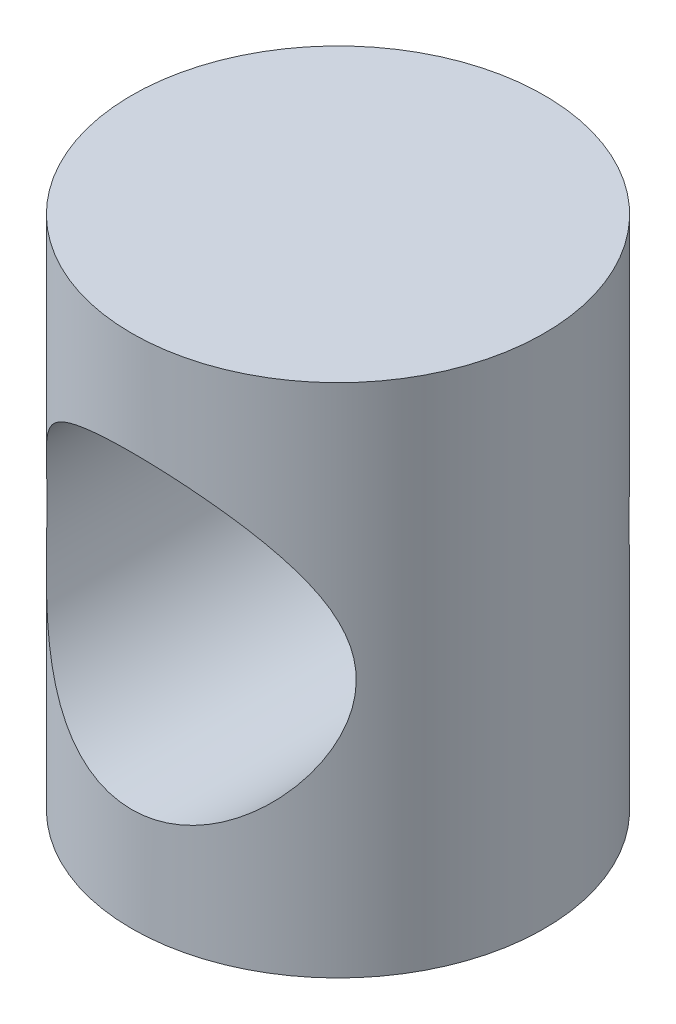
ISO-10303-21;
HEADER;
FILE_DESCRIPTION(('STEP AP214'),'2;1');
FILE_NAME('part.step','',(''),(''),'','','');
FILE_SCHEMA(('AUTOMOTIVE_DESIGN { 1 0 10303 214 1 1 1 1 }'));
ENDSEC;
DATA;
#1=APPLICATION_CONTEXT('core data for automotive mechanical design processes');
#2=APPLICATION_PROTOCOL_DEFINITION('international standard','automotive_design',2000,#1);
#3=PRODUCT_CONTEXT('',#1,'mechanical');
#4=PRODUCT('Part','Part','',(#3));
#5=PRODUCT_RELATED_PRODUCT_CATEGORY('part','',(#4));
#6=PRODUCT_DEFINITION_FORMATION('','',#4);
#7=PRODUCT_DEFINITION_CONTEXT('part definition',#1,'design');
#8=PRODUCT_DEFINITION('design','',#6,#7);
#9=PRODUCT_DEFINITION_SHAPE('','',#8);
#10=(LENGTH_UNIT() NAMED_UNIT(*) SI_UNIT(.MILLI.,.METRE.));
#11=(NAMED_UNIT(*) PLANE_ANGLE_UNIT() SI_UNIT($,.RADIAN.));
#12=(NAMED_UNIT(*) SI_UNIT($,.STERADIAN.) SOLID_ANGLE_UNIT());
#13=UNCERTAINTY_MEASURE_WITH_UNIT(LENGTH_MEASURE(1.E-05),#10,'distance_accuracy_value','');
#14=(GEOMETRIC_REPRESENTATION_CONTEXT(3) GLOBAL_UNCERTAINTY_ASSIGNED_CONTEXT((#13)) GLOBAL_UNIT_ASSIGNED_CONTEXT((#10,
#11,#12)) REPRESENTATION_CONTEXT('',''));
#15=CARTESIAN_POINT('',(0.,0.,0.));
#16=DIRECTION('',(0.,0.,1.));
#17=DIRECTION('',(1.,0.,0.));
#18=AXIS2_PLACEMENT_3D('',#15,#16,#17);
#19=CARTESIAN_POINT('',(0.,5.,0.));
#20=DIRECTION('',(0.,1.,0.));
#21=DIRECTION('',(0.,0.,1.));
#22=AXIS2_PLACEMENT_3D('',#19,#20,#21);
#23=PLANE('',#22);
#24=CARTESIAN_POINT('',(0.,5.,0.));
#25=DIRECTION('',(0.,1.,0.));
#26=DIRECTION('',(0.,0.,1.));
#27=AXIS2_PLACEMENT_3D('',#24,#25,#26);
#28=CIRCLE('',#27,2.);
#29=CARTESIAN_POINT('',(0.,5.,2.));
#30=VERTEX_POINT('',#29);
#31=EDGE_CURVE('E92',#30,#30,#28,.T.);
#32=ORIENTED_EDGE('',*,*,#31,.T.);
#33=EDGE_LOOP('',(#32));
#34=FACE_BOUND('',#33,.T.);
#35=ADVANCED_FACE('F72',(#34),#23,.T.);
#36=CARTESIAN_POINT('',(0.,0.,0.));
#37=DIRECTION('',(0.,1.,0.));
#38=DIRECTION('',(0.,0.,1.));
#39=AXIS2_PLACEMENT_3D('',#36,#37,#38);
#40=PLANE('',#39);
#41=CARTESIAN_POINT('',(0.,0.,0.));
#42=DIRECTION('',(0.,1.,0.));
#43=DIRECTION('',(0.,0.,1.));
#44=AXIS2_PLACEMENT_3D('',#41,#42,#43);
#45=CIRCLE('',#44,2.);
#46=CARTESIAN_POINT('',(0.,0.,2.));
#47=VERTEX_POINT('',#46);
#48=EDGE_CURVE('E88',#47,#47,#45,.T.);
#49=ORIENTED_EDGE('',*,*,#48,.F.);
#50=EDGE_LOOP('',(#49));
#51=FACE_BOUND('',#50,.T.);
#52=ADVANCED_FACE('F74',(#51),#40,.F.);
#53=CARTESIAN_POINT('',(0.,2.5,-2.));
#54=DIRECTION('',(0.,0.,1.));
#55=DIRECTION('',(1.,0.,0.));
#56=AXIS2_PLACEMENT_3D('',#53,#54,#55);
#57=CYLINDRICAL_SURFACE('',#56,1.5);
#58=CARTESIAN_POINT('',(0.,4.,-2.));
#59=CARTESIAN_POINT('',(-0.0733238168883633,3.99999566298493,-1.99999582732985));
#60=CARTESIAN_POINT('',(-0.14668514696909,3.99458679289183,-1.99593030514466));
#61=CARTESIAN_POINT('',(-0.291031393710365,3.9733088012809,-1.98004809806574));
#62=CARTESIAN_POINT('',(-0.362013853880637,3.95742919711072,-1.96822364546775));
#63=CARTESIAN_POINT('',(-0.499226006736961,3.91629069380892,-1.93795940216806));
#64=CARTESIAN_POINT('',(-0.565479447961751,3.89108327384293,-1.91955593885509));
#65=CARTESIAN_POINT('',(-0.692400320708705,3.83246927536516,-1.8775137850865));
#66=CARTESIAN_POINT('',(-0.753067446036845,3.7990622477885,-1.85387480790637));
#67=CARTESIAN_POINT('',(-0.873468550310338,3.72173549036761,-1.80049441205848));
#68=CARTESIAN_POINT('',(-0.932597680301103,3.6771293706302,-1.77039085687857));
#69=CARTESIAN_POINT('',(-1.04303088076967,3.58050031792622,-1.70766776976302));
#70=CARTESIAN_POINT('',(-1.09432320399861,3.52846647241548,-1.67504456900533));
#71=CARTESIAN_POINT('',(-1.19837128676082,3.40641746194881,-1.60271148251862));
#72=CARTESIAN_POINT('',(-1.24930515925708,3.33489720925114,-1.56290904326244));
#73=CARTESIAN_POINT('',(-1.33861950030476,3.18254998804343,-1.48711489074728));
#74=CARTESIAN_POINT('',(-1.37701697513755,3.10173583027239,-1.45111806021123));
#75=CARTESIAN_POINT('',(-1.42880629654057,2.96049711350408,-1.39977153462232));
#76=CARTESIAN_POINT('',(-1.44625677448576,2.90260920437311,-1.38157748099639));
#77=CARTESIAN_POINT('',(-1.4742067432798,2.78360716138381,-1.35171592156367));
#78=CARTESIAN_POINT('',(-1.48472215909638,2.72250076932552,-1.34003347280188));
#79=CARTESIAN_POINT('',(-1.49812821587031,2.59781746728411,-1.3250376031534));
#80=CARTESIAN_POINT('',(-1.50094954405843,2.53422330069143,-1.32180027198211));
#81=CARTESIAN_POINT('',(-1.49848214107473,2.40738519595469,-1.32459530781419));
#82=CARTESIAN_POINT('',(-1.49319048866828,2.34414139219557,-1.33063101375447));
#83=CARTESIAN_POINT('',(-1.47597738127146,2.22680856967773,-1.34967624602736));
#84=CARTESIAN_POINT('',(-1.46482483213393,2.17246346629251,-1.36187160711147));
#85=CARTESIAN_POINT('',(-1.43705665967472,2.06656096666638,-1.39114197964015));
#86=CARTESIAN_POINT('',(-1.42043580174443,2.01500629688714,-1.40822166460929));
#87=CARTESIAN_POINT('',(-1.37033053483048,1.8837433063796,-1.45741780802484));
#88=CARTESIAN_POINT('',(-1.33280125154412,1.8065990023113,-1.49225675406362));
#89=CARTESIAN_POINT('',(-1.24617980845438,1.66080295010744,-1.5653332737001));
#90=CARTESIAN_POINT('',(-1.19705963959762,1.5921723979568,-1.60357893794201));
#91=CARTESIAN_POINT('',(-1.08652041546593,1.4622515349125,-1.68051381321895));
#92=CARTESIAN_POINT('',(-1.02482371790806,1.40118857745593,-1.71919007917324));
#93=CARTESIAN_POINT('',(-0.890432683412945,1.2897438618303,-1.79247519341789));
#94=CARTESIAN_POINT('',(-0.817758175443478,1.2393432307867,-1.82709117937862));
#95=CARTESIAN_POINT('',(-0.677874986679999,1.16000272958802,-1.88280890008291));
#96=CARTESIAN_POINT('',(-0.612485632402769,1.12878643178463,-1.90522876624556));
#97=CARTESIAN_POINT('',(-0.476277786535075,1.07575398481977,-1.94374438176642));
#98=CARTESIAN_POINT('',(-0.405467967926301,1.05392317408628,-1.95984999147025));
#99=CARTESIAN_POINT('',(-0.278754069890312,1.02508402209845,-1.98123986707286));
#100=CARTESIAN_POINT('',(-0.223667369488179,1.01571309060527,-1.98823801093148));
#101=CARTESIAN_POINT('',(-0.112394497180507,1.00316926297947,-1.99761979157085));
#102=CARTESIAN_POINT('',(-0.0562082706902792,0.999996675348782,-2.00000319866836));
#103=CARTESIAN_POINT('',(0.073323816888364,1.00000433701507,-1.99999582732985));
#104=CARTESIAN_POINT('',(0.146685146969091,1.00541320710817,-1.99593030514466));
#105=CARTESIAN_POINT('',(0.291031393710366,1.0266911987191,-1.98004809806574));
#106=CARTESIAN_POINT('',(0.362013853880638,1.04257080288928,-1.96822364546775));
#107=CARTESIAN_POINT('',(0.499226006736962,1.08370930619108,-1.93795940216806));
#108=CARTESIAN_POINT('',(0.565479447961751,1.10891672615707,-1.91955593885509));
#109=CARTESIAN_POINT('',(0.692400320708705,1.16753072463484,-1.8775137850865));
#110=CARTESIAN_POINT('',(0.753067446036845,1.2009377522115,-1.85387480790637));
#111=CARTESIAN_POINT('',(0.873468550310339,1.27826450963239,-1.80049441205848));
#112=CARTESIAN_POINT('',(0.932597680301103,1.3228706293698,-1.77039085687857));
#113=CARTESIAN_POINT('',(1.04303088076967,1.41949968207378,-1.70766776976301));
#114=CARTESIAN_POINT('',(1.09432320399861,1.47153352758452,-1.67504456900533));
#115=CARTESIAN_POINT('',(1.19837128676082,1.59358253805119,-1.60271148251862));
#116=CARTESIAN_POINT('',(1.24930515925708,1.66510279074887,-1.56290904326244));
#117=CARTESIAN_POINT('',(1.33861950030476,1.81745001195657,-1.48711489074728));
#118=CARTESIAN_POINT('',(1.37701697513755,1.89826416972761,-1.45111806021123));
#119=CARTESIAN_POINT('',(1.42880629654057,2.03950288649592,-1.39977153462232));
#120=CARTESIAN_POINT('',(1.44625677448576,2.09739079562689,-1.38157748099639));
#121=CARTESIAN_POINT('',(1.4742067432798,2.21639283861619,-1.35171592156367));
#122=CARTESIAN_POINT('',(1.48472215909638,2.27749923067449,-1.34003347280188));
#123=CARTESIAN_POINT('',(1.49812821587031,2.4021825327159,-1.3250376031534));
#124=CARTESIAN_POINT('',(1.50094954405843,2.46577669930857,-1.32180027198211));
#125=CARTESIAN_POINT('',(1.49848214107473,2.59261480404531,-1.32459530781419));
#126=CARTESIAN_POINT('',(1.49319048866828,2.65585860780443,-1.33063101375447));
#127=CARTESIAN_POINT('',(1.47597738127146,2.77319143032227,-1.34967624602737));
#128=CARTESIAN_POINT('',(1.46482483213393,2.8275365337075,-1.36187160711147));
#129=CARTESIAN_POINT('',(1.43705665967472,2.93343903333362,-1.39114197964015));
#130=CARTESIAN_POINT('',(1.42043580174443,2.98499370311287,-1.40822166460929));
#131=CARTESIAN_POINT('',(1.37033053483048,3.1162566936204,-1.45741780802484));
#132=CARTESIAN_POINT('',(1.33280125154412,3.1934009976887,-1.49225675406362));
#133=CARTESIAN_POINT('',(1.24617980845438,3.33919704989256,-1.5653332737001));
#134=CARTESIAN_POINT('',(1.19705963959762,3.4078276020432,-1.60357893794201));
#135=CARTESIAN_POINT('',(1.08652041546593,3.5377484650875,-1.68051381321895));
#136=CARTESIAN_POINT('',(1.02482371790806,3.59881142254407,-1.71919007917324));
#137=CARTESIAN_POINT('',(0.890432683412945,3.7102561381697,-1.79247519341789));
#138=CARTESIAN_POINT('',(0.817758175443478,3.7606567692133,-1.82709117937862));
#139=CARTESIAN_POINT('',(0.677874986679999,3.83999727041198,-1.88280890008291));
#140=CARTESIAN_POINT('',(0.612485632402769,3.87121356821538,-1.90522876624556));
#141=CARTESIAN_POINT('',(0.476277786535074,3.92424601518023,-1.94374438176642));
#142=CARTESIAN_POINT('',(0.4054679679263,3.94607682591372,-1.95984999147025));
#143=CARTESIAN_POINT('',(0.278754069890311,3.97491597790155,-1.98123986707286));
#144=CARTESIAN_POINT('',(0.223667369488178,3.98428690939473,-1.98823801093148));
#145=CARTESIAN_POINT('',(0.112394497180506,3.99683073702053,-1.99761979157085));
#146=CARTESIAN_POINT('',(0.0562082706902792,4.00000332465122,-2.00000319866836));
#147=CARTESIAN_POINT('',(0.,4.,-2.));
#148=B_SPLINE_CURVE_WITH_KNOTS('',3,(#58,#59,#60,#61,#62,#63,#64,#65,#66,#67,#68,#69,#70,#71,
#72,#73,#74,#75,#76,#77,#78,#79,#80,#81,#82,#83,#84,#85,#86,#87,#88,#89,#90,#91,#92,#93,#94,#95,
#96,#97,#98,#99,#100,#101,#102,#103,#104,#105,#106,#107,#108,#109,#110,#111,#112,#113,#114,#115,
#116,#117,#118,#119,#120,#121,#122,#123,#124,#125,#126,#127,#128,#129,#130,#131,#132,#133,#134,
#135,#136,#137,#138,#139,#140,#141,#142,#143,#144,#145,#146,#147),.UNSPECIFIED.,.T.,.F.,(4,2,2,
2,2,2,2,2,2,2,2,2,2,2,2,2,2,2,2,2,2,2,2,2,2,2,2,2,2,2,2,2,2,2,2,2,2,2,2,2,2,2,2,2,4),(0.,
0.219737979931881,0.439696282648436,0.658458337658062,0.877232376202583,1.11623310988778,
1.35558865936366,1.64359835682849,1.93121571479709,2.11999531937708,2.30833990629147,
2.49837569077001,2.68847991735786,2.85826912974225,3.02822135024108,3.30449433924013,
3.58144189728547,3.86533764056814,4.14872658940876,4.37537162341049,4.60166130508969,
4.77009876092341,4.93854459995755,5.15828257988943,5.37824088260599,5.59700293761561,
5.81577697616013,6.05477770984534,6.29413325932121,6.58214295678604,6.86976031475464,
7.05853991933464,7.24688450624902,7.43692029072756,7.62702451731541,7.79681372969981,
7.96676595019863,8.24303893919769,8.51998649724302,8.80388224052569,9.08727118936631,
9.31391622336805,9.54020590504724,9.70864336088096,9.8770891999151),.UNSPECIFIED.);
#149=CARTESIAN_POINT('',(0.,4.,-2.));
#150=VERTEX_POINT('',#149);
#151=EDGE_CURVE('E84',#150,#150,#148,.T.);
#152=ORIENTED_EDGE('',*,*,#151,.F.);
#153=EDGE_LOOP('',(#152));
#154=FACE_BOUND('',#153,.T.);
#155=CARTESIAN_POINT('',(0.,4.,2.));
#156=CARTESIAN_POINT('',(0.0733238168883637,3.99999566298493,1.99999582732985));
#157=CARTESIAN_POINT('',(0.146685146969091,3.99458679289183,1.99593030514466));
#158=CARTESIAN_POINT('',(0.291031393710366,3.9733088012809,1.98004809806574));
#159=CARTESIAN_POINT('',(0.362013853880638,3.95742919711072,1.96822364546775));
#160=CARTESIAN_POINT('',(0.499226006736962,3.91629069380892,1.93795940216806));
#161=CARTESIAN_POINT('',(0.565479447961752,3.89108327384293,1.91955593885509));
#162=CARTESIAN_POINT('',(0.692400320708705,3.83246927536516,1.8775137850865));
#163=CARTESIAN_POINT('',(0.753067446036846,3.7990622477885,1.85387480790636));
#164=CARTESIAN_POINT('',(0.873468550310339,3.72173549036761,1.80049441205848));
#165=CARTESIAN_POINT('',(0.932597680301104,3.6771293706302,1.77039085687857));
#166=CARTESIAN_POINT('',(1.04303088076967,3.58050031792622,1.70766776976302));
#167=CARTESIAN_POINT('',(1.09432320399861,3.52846647241548,1.67504456900533));
#168=CARTESIAN_POINT('',(1.19837128676082,3.40641746194881,1.60271148251862));
#169=CARTESIAN_POINT('',(1.24930515925708,3.33489720925113,1.56290904326244));
#170=CARTESIAN_POINT('',(1.33861950030476,3.18254998804343,1.48711489074727));
#171=CARTESIAN_POINT('',(1.37701697513755,3.10173583027239,1.45111806021123));
#172=CARTESIAN_POINT('',(1.42880629654057,2.96049711350408,1.39977153462232));
#173=CARTESIAN_POINT('',(1.44625677448576,2.90260920437311,1.38157748099639));
#174=CARTESIAN_POINT('',(1.4742067432798,2.78360716138381,1.35171592156367));
#175=CARTESIAN_POINT('',(1.48472215909638,2.72250076932551,1.34003347280188));
#176=CARTESIAN_POINT('',(1.49812821587031,2.5978174672841,1.3250376031534));
#177=CARTESIAN_POINT('',(1.50094954405843,2.53422330069143,1.32180027198211));
#178=CARTESIAN_POINT('',(1.49848214107473,2.40738519595469,1.32459530781419));
#179=CARTESIAN_POINT('',(1.49319048866828,2.34414139219557,1.33063101375447));
#180=CARTESIAN_POINT('',(1.47597738127146,2.22680856967773,1.34967624602737));
#181=CARTESIAN_POINT('',(1.46482483213393,2.17246346629251,1.36187160711147));
#182=CARTESIAN_POINT('',(1.43705665967472,2.06656096666638,1.39114197964014));
#183=CARTESIAN_POINT('',(1.42043580174443,2.01500629688713,1.40822166460929));
#184=CARTESIAN_POINT('',(1.37033053483048,1.8837433063796,1.45741780802484));
#185=CARTESIAN_POINT('',(1.33280125154412,1.8065990023113,1.49225675406362));
#186=CARTESIAN_POINT('',(1.24617980845438,1.66080295010744,1.5653332737001));
#187=CARTESIAN_POINT('',(1.19705963959762,1.5921723979568,1.60357893794201));
#188=CARTESIAN_POINT('',(1.08652041546593,1.4622515349125,1.68051381321895));
#189=CARTESIAN_POINT('',(1.02482371790806,1.40118857745593,1.71919007917324));
#190=CARTESIAN_POINT('',(0.890432683412945,1.2897438618303,1.79247519341789));
#191=CARTESIAN_POINT('',(0.817758175443477,1.2393432307867,1.82709117937862));
#192=CARTESIAN_POINT('',(0.677874986679999,1.16000272958802,1.88280890008291));
#193=CARTESIAN_POINT('',(0.612485632402769,1.12878643178462,1.90522876624556));
#194=CARTESIAN_POINT('',(0.476277786535074,1.07575398481977,1.94374438176642));
#195=CARTESIAN_POINT('',(0.405467967926301,1.05392317408628,1.95984999147025));
#196=CARTESIAN_POINT('',(0.278754069890311,1.02508402209845,1.98123986707286));
#197=CARTESIAN_POINT('',(0.223667369488179,1.01571309060527,1.98823801093148));
#198=CARTESIAN_POINT('',(0.112394497180507,1.00316926297947,1.99761979157085));
#199=CARTESIAN_POINT('',(0.0562082706902795,0.999996675348782,2.00000319866836));
#200=CARTESIAN_POINT('',(-0.0733238168883632,1.00000433701507,1.99999582732985));
#201=CARTESIAN_POINT('',(-0.14668514696909,1.00541320710817,1.99593030514466));
#202=CARTESIAN_POINT('',(-0.291031393710365,1.0266911987191,1.98004809806574));
#203=CARTESIAN_POINT('',(-0.362013853880638,1.04257080288928,1.96822364546775));
#204=CARTESIAN_POINT('',(-0.499226006736962,1.08370930619108,1.93795940216806));
#205=CARTESIAN_POINT('',(-0.565479447961752,1.10891672615707,1.91955593885509));
#206=CARTESIAN_POINT('',(-0.692400320708705,1.16753072463484,1.8775137850865));
#207=CARTESIAN_POINT('',(-0.753067446036846,1.2009377522115,1.85387480790636));
#208=CARTESIAN_POINT('',(-0.873468550310339,1.27826450963239,1.80049441205848));
#209=CARTESIAN_POINT('',(-0.932597680301103,1.3228706293698,1.77039085687857));
#210=CARTESIAN_POINT('',(-1.04303088076967,1.41949968207378,1.70766776976302));
#211=CARTESIAN_POINT('',(-1.09432320399861,1.47153352758452,1.67504456900533));
#212=CARTESIAN_POINT('',(-1.19837128676082,1.59358253805119,1.60271148251862));
#213=CARTESIAN_POINT('',(-1.24930515925708,1.66510279074887,1.56290904326244));
#214=CARTESIAN_POINT('',(-1.33861950030476,1.81745001195657,1.48711489074728));
#215=CARTESIAN_POINT('',(-1.37701697513755,1.89826416972761,1.45111806021123));
#216=CARTESIAN_POINT('',(-1.42880629654057,2.03950288649592,1.39977153462232));
#217=CARTESIAN_POINT('',(-1.44625677448576,2.09739079562689,1.38157748099639));
#218=CARTESIAN_POINT('',(-1.4742067432798,2.21639283861619,1.35171592156367));
#219=CARTESIAN_POINT('',(-1.48472215909638,2.27749923067449,1.34003347280188));
#220=CARTESIAN_POINT('',(-1.49812821587031,2.4021825327159,1.3250376031534));
#221=CARTESIAN_POINT('',(-1.50094954405843,2.46577669930857,1.32180027198211));
#222=CARTESIAN_POINT('',(-1.49848214107473,2.59261480404531,1.32459530781419));
#223=CARTESIAN_POINT('',(-1.49319048866828,2.65585860780443,1.33063101375447));
#224=CARTESIAN_POINT('',(-1.47597738127146,2.77319143032227,1.34967624602737));
#225=CARTESIAN_POINT('',(-1.46482483213393,2.8275365337075,1.36187160711147));
#226=CARTESIAN_POINT('',(-1.43705665967472,2.93343903333362,1.39114197964015));
#227=CARTESIAN_POINT('',(-1.42043580174443,2.98499370311287,1.40822166460929));
#228=CARTESIAN_POINT('',(-1.37033053483048,3.1162566936204,1.45741780802484));
#229=CARTESIAN_POINT('',(-1.33280125154412,3.1934009976887,1.49225675406362));
#230=CARTESIAN_POINT('',(-1.24617980845438,3.33919704989256,1.5653332737001));
#231=CARTESIAN_POINT('',(-1.19705963959762,3.4078276020432,1.60357893794201));
#232=CARTESIAN_POINT('',(-1.08652041546593,3.5377484650875,1.68051381321895));
#233=CARTESIAN_POINT('',(-1.02482371790805,3.59881142254407,1.71919007917324));
#234=CARTESIAN_POINT('',(-0.890432683412943,3.7102561381697,1.79247519341789));
#235=CARTESIAN_POINT('',(-0.817758175443476,3.76065676921331,1.82709117937862));
#236=CARTESIAN_POINT('',(-0.677874986679998,3.83999727041198,1.88280890008291));
#237=CARTESIAN_POINT('',(-0.612485632402768,3.87121356821538,1.90522876624556));
#238=CARTESIAN_POINT('',(-0.476277786535074,3.92424601518023,1.94374438176642));
#239=CARTESIAN_POINT('',(-0.4054679679263,3.94607682591372,1.95984999147025));
#240=CARTESIAN_POINT('',(-0.27875406989031,3.97491597790155,1.98123986707286));
#241=CARTESIAN_POINT('',(-0.223667369488178,3.98428690939473,1.98823801093148));
#242=CARTESIAN_POINT('',(-0.112394497180506,3.99683073702053,1.99761979157085));
#243=CARTESIAN_POINT('',(-0.0562082706902792,4.00000332465122,2.00000319866836));
#244=CARTESIAN_POINT('',(0.,4.,2.));
#245=B_SPLINE_CURVE_WITH_KNOTS('',3,(#155,#156,#157,#158,#159,#160,#161,#162,#163,#164,#165,
#166,#167,#168,#169,#170,#171,#172,#173,#174,#175,#176,#177,#178,#179,#180,#181,#182,#183,#184,
#185,#186,#187,#188,#189,#190,#191,#192,#193,#194,#195,#196,#197,#198,#199,#200,#201,#202,#203,
#204,#205,#206,#207,#208,#209,#210,#211,#212,#213,#214,#215,#216,#217,#218,#219,#220,#221,#222,
#223,#224,#225,#226,#227,#228,#229,#230,#231,#232,#233,#234,#235,#236,#237,#238,#239,#240,#241,
#242,#243,#244),.UNSPECIFIED.,.T.,.F.,(4,2,2,2,2,2,2,2,2,2,2,2,2,2,2,2,2,2,2,2,2,2,2,2,2,2,2,2,
2,2,2,2,2,2,2,2,2,2,2,2,2,2,2,2,4),(0.,0.219737979931881,0.439696282648436,0.658458337658062,
0.877232376202583,1.11623310988778,1.35558865936366,1.64359835682849,1.93121571479709,
2.11999531937708,2.30833990629147,2.49837569077001,2.68847991735786,2.85826912974225,
3.02822135024108,3.30449433924014,3.58144189728547,3.86533764056814,4.14872658940876,
4.3753716234105,4.60166130508969,4.77009876092341,4.93854459995755,5.15828257988943,
5.37824088260599,5.59700293761562,5.81577697616014,6.05477770984534,6.29413325932121,
6.58214295678604,6.86976031475465,7.05853991933464,7.24688450624902,7.43692029072756,
7.62702451731541,7.79681372969981,7.96676595019864,8.24303893919769,8.51998649724302,
8.8038822405257,9.08727118936631,9.31391622336805,9.54020590504724,9.70864336088096,
9.87708919991511),.UNSPECIFIED.);
#246=CARTESIAN_POINT('',(0.,4.,2.));
#247=VERTEX_POINT('',#246);
#248=EDGE_CURVE('E11',#247,#247,#245,.T.);
#249=ORIENTED_EDGE('',*,*,#248,.F.);
#250=EDGE_LOOP('',(#249));
#251=FACE_BOUND('',#250,.T.);
#252=ADVANCED_FACE('F98',(#154,#251),#57,.F.);
#253=CARTESIAN_POINT('',(0.,0.,0.));
#254=DIRECTION('',(0.,1.,0.));
#255=DIRECTION('',(0.,0.,1.));
#256=AXIS2_PLACEMENT_3D('',#253,#254,#255);
#257=CYLINDRICAL_SURFACE('',#256,2.);
#258=ORIENTED_EDGE('',*,*,#31,.F.);
#259=EDGE_LOOP('',(#258));
#260=FACE_BOUND('',#259,.T.);
#261=ORIENTED_EDGE('',*,*,#248,.T.);
#262=EDGE_LOOP('',(#261));
#263=FACE_BOUND('',#262,.T.);
#264=ORIENTED_EDGE('',*,*,#48,.T.);
#265=EDGE_LOOP('',(#264));
#266=FACE_BOUND('',#265,.T.);
#267=ORIENTED_EDGE('',*,*,#151,.T.);
#268=EDGE_LOOP('',(#267));
#269=FACE_BOUND('',#268,.T.);
#270=ADVANCED_FACE('F100',(#260,#263,#266,#269),#257,.T.);
#271=CLOSED_SHELL('',(#35,#52,#252,#270));
#272=MANIFOLD_SOLID_BREP('B2',#271);
#273=ADVANCED_BREP_SHAPE_REPRESENTATION('',(#18,#272),#14);
#274=SHAPE_DEFINITION_REPRESENTATION(#9,#273);
ENDSEC;
END-ISO-10303-21;
